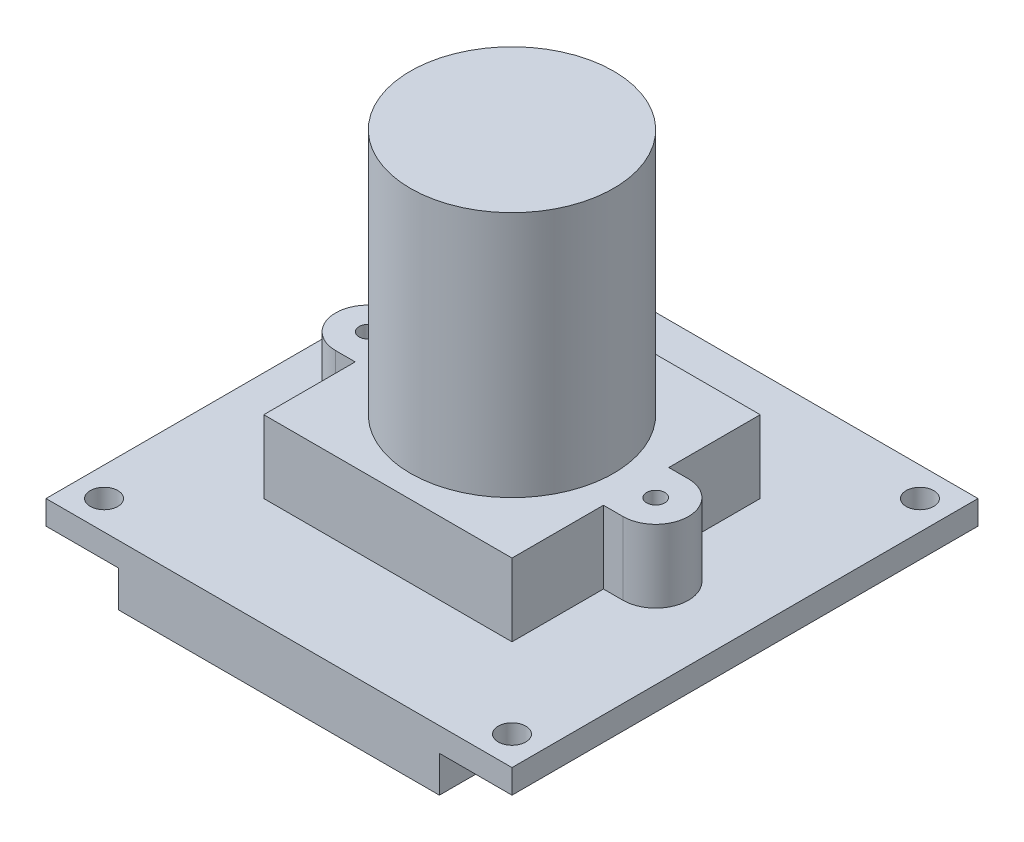
ISO-10303-21;
HEADER;
FILE_DESCRIPTION(('STEP AP214'),'2;1');
FILE_NAME('part.step','',(''),(''),'','','');
FILE_SCHEMA(('AUTOMOTIVE_DESIGN { 1 0 10303 214 1 1 1 1 }'));
ENDSEC;
DATA;
#1=APPLICATION_CONTEXT('core data for automotive mechanical design processes');
#2=APPLICATION_PROTOCOL_DEFINITION('international standard','automotive_design',2000,#1);
#3=PRODUCT_CONTEXT('',#1,'mechanical');
#4=PRODUCT('Part','Part','',(#3));
#5=PRODUCT_RELATED_PRODUCT_CATEGORY('part','',(#4));
#6=PRODUCT_DEFINITION_FORMATION('','',#4);
#7=PRODUCT_DEFINITION_CONTEXT('part definition',#1,'design');
#8=PRODUCT_DEFINITION('design','',#6,#7);
#9=PRODUCT_DEFINITION_SHAPE('','',#8);
#10=(LENGTH_UNIT() NAMED_UNIT(*) SI_UNIT(.MILLI.,.METRE.));
#11=(NAMED_UNIT(*) PLANE_ANGLE_UNIT() SI_UNIT($,.RADIAN.));
#12=(NAMED_UNIT(*) SI_UNIT($,.STERADIAN.) SOLID_ANGLE_UNIT());
#13=UNCERTAINTY_MEASURE_WITH_UNIT(LENGTH_MEASURE(1.E-05),#10,'distance_accuracy_value','');
#14=(GEOMETRIC_REPRESENTATION_CONTEXT(3) GLOBAL_UNCERTAINTY_ASSIGNED_CONTEXT((#13)) GLOBAL_UNIT_ASSIGNED_CONTEXT((#10,
#11,#12)) REPRESENTATION_CONTEXT('',''));
#15=CARTESIAN_POINT('',(0.,0.,0.));
#16=DIRECTION('',(0.,0.,1.));
#17=DIRECTION('',(1.,0.,0.));
#18=AXIS2_PLACEMENT_3D('',#15,#16,#17);
#19=CARTESIAN_POINT('',(0.,0.,0.));
#20=DIRECTION('',(0.,1.,0.));
#21=DIRECTION('',(0.,0.,1.));
#22=AXIS2_PLACEMENT_3D('',#19,#20,#21);
#23=PLANE('',#22);
#24=CARTESIAN_POINT('',(-14.05,0.,14.05));
#25=DIRECTION('',(0.,1.,0.));
#26=DIRECTION('',(0.,0.,-1.));
#27=AXIS2_PLACEMENT_3D('',#24,#25,#26);
#28=CIRCLE('',#27,0.949999999999999);
#29=CARTESIAN_POINT('',(-14.05,0.,13.1));
#30=VERTEX_POINT('',#29);
#31=EDGE_CURVE('E248',#30,#30,#28,.T.);
#32=ORIENTED_EDGE('',*,*,#31,.T.);
#33=EDGE_LOOP('',(#32));
#34=FACE_BOUND('',#33,.T.);
#35=CARTESIAN_POINT('',(14.05,0.,14.05));
#36=DIRECTION('',(0.,1.,0.));
#37=DIRECTION('',(0.,0.,1.));
#38=AXIS2_PLACEMENT_3D('',#35,#36,#37);
#39=CIRCLE('',#38,0.949999999999999);
#40=CARTESIAN_POINT('',(14.05,0.,15.));
#41=VERTEX_POINT('',#40);
#42=EDGE_CURVE('E253',#41,#41,#39,.T.);
#43=ORIENTED_EDGE('',*,*,#42,.T.);
#44=EDGE_LOOP('',(#43));
#45=FACE_BOUND('',#44,.T.);
#46=CARTESIAN_POINT('',(14.05,0.,-14.05));
#47=DIRECTION('',(0.,1.,0.));
#48=DIRECTION('',(0.,0.,-1.));
#49=AXIS2_PLACEMENT_3D('',#46,#47,#48);
#50=CIRCLE('',#49,0.949999999999999);
#51=CARTESIAN_POINT('',(14.05,0.,-15.));
#52=VERTEX_POINT('',#51);
#53=EDGE_CURVE('E261',#52,#52,#50,.T.);
#54=ORIENTED_EDGE('',*,*,#53,.T.);
#55=EDGE_LOOP('',(#54));
#56=FACE_BOUND('',#55,.T.);
#57=CARTESIAN_POINT('',(-14.05,0.,-14.05));
#58=DIRECTION('',(0.,1.,0.));
#59=DIRECTION('',(0.,0.,1.));
#60=AXIS2_PLACEMENT_3D('',#57,#58,#59);
#61=CIRCLE('',#60,0.949999999999999);
#62=CARTESIAN_POINT('',(-14.05,0.,-13.1));
#63=VERTEX_POINT('',#62);
#64=EDGE_CURVE('E269',#63,#63,#61,.T.);
#65=ORIENTED_EDGE('',*,*,#64,.T.);
#66=EDGE_LOOP('',(#65));
#67=FACE_BOUND('',#66,.T.);
#68=DIRECTION('',(0.,0.,-1.));
#69=VECTOR('',#68,1.);
#70=CARTESIAN_POINT('',(-11.05,0.,16.05));
#71=LINE('',#70,#69);
#72=CARTESIAN_POINT('',(-11.05,0.,16.05));
#73=VERTEX_POINT('',#72);
#74=CARTESIAN_POINT('',(-11.05,0.,9.3));
#75=VERTEX_POINT('',#74);
#76=EDGE_CURVE('E201',#73,#75,#71,.T.);
#77=ORIENTED_EDGE('',*,*,#76,.F.);
#78=DIRECTION('',(1.,0.,0.));
#79=VECTOR('',#78,1.);
#80=CARTESIAN_POINT('',(-16.05,0.,16.05));
#81=LINE('',#80,#79);
#82=CARTESIAN_POINT('',(-16.05,0.,16.05));
#83=VERTEX_POINT('',#82);
#84=EDGE_CURVE('E300',#83,#73,#81,.T.);
#85=ORIENTED_EDGE('',*,*,#84,.F.);
#86=DIRECTION('',(0.,0.,1.));
#87=VECTOR('',#86,1.);
#88=CARTESIAN_POINT('',(-16.05,0.,-16.05));
#89=LINE('',#88,#87);
#90=CARTESIAN_POINT('',(-16.05,0.,-16.05));
#91=VERTEX_POINT('',#90);
#92=EDGE_CURVE('E277',#91,#83,#89,.T.);
#93=ORIENTED_EDGE('',*,*,#92,.F.);
#94=DIRECTION('',(-1.,0.,0.));
#95=VECTOR('',#94,1.);
#96=CARTESIAN_POINT('',(-16.05,0.,-16.05));
#97=LINE('',#96,#95);
#98=CARTESIAN_POINT('',(16.05,0.,-16.05));
#99=VERTEX_POINT('',#98);
#100=EDGE_CURVE('E286',#99,#91,#97,.T.);
#101=ORIENTED_EDGE('',*,*,#100,.F.);
#102=DIRECTION('',(0.,0.,-1.));
#103=VECTOR('',#102,1.);
#104=CARTESIAN_POINT('',(16.05,0.,-16.05));
#105=LINE('',#104,#103);
#106=CARTESIAN_POINT('',(16.05,0.,16.05));
#107=VERTEX_POINT('',#106);
#108=EDGE_CURVE('E304',#107,#99,#105,.T.);
#109=ORIENTED_EDGE('',*,*,#108,.F.);
#110=CARTESIAN_POINT('',(11.05,0.,16.05));
#111=VERTEX_POINT('',#110);
#112=EDGE_CURVE('E299',#111,#107,#81,.T.);
#113=ORIENTED_EDGE('',*,*,#112,.F.);
#114=DIRECTION('',(0.,0.,1.));
#115=VECTOR('',#114,1.);
#116=CARTESIAN_POINT('',(11.05,0.,16.05));
#117=LINE('',#116,#115);
#118=CARTESIAN_POINT('',(11.05,0.,9.3));
#119=VERTEX_POINT('',#118);
#120=EDGE_CURVE('E217',#119,#111,#117,.T.);
#121=ORIENTED_EDGE('',*,*,#120,.F.);
#122=DIRECTION('',(1.,0.,0.));
#123=VECTOR('',#122,1.);
#124=CARTESIAN_POINT('',(-11.05,0.,9.3));
#125=LINE('',#124,#123);
#126=EDGE_CURVE('E206',#75,#119,#125,.T.);
#127=ORIENTED_EDGE('',*,*,#126,.F.);
#128=EDGE_LOOP('',(#77,#85,#93,#101,#109,#113,#121,#127));
#129=FACE_BOUND('',#128,.T.);
#130=ADVANCED_FACE('F39',(#34,#45,#56,#67,#129),#23,.F.);
#131=CARTESIAN_POINT('',(0.,1.65,0.));
#132=DIRECTION('',(0.,1.,0.));
#133=DIRECTION('',(0.,0.,1.));
#134=AXIS2_PLACEMENT_3D('',#131,#132,#133);
#135=PLANE('',#134);
#136=DIRECTION('',(0.,0.,1.));
#137=VECTOR('',#136,1.);
#138=CARTESIAN_POINT('',(-8.55,1.65,-8.55));
#139=LINE('',#138,#137);
#140=CARTESIAN_POINT('',(-8.55,1.65,-8.55));
#141=VERTEX_POINT('',#140);
#142=CARTESIAN_POINT('',(-8.55,1.65,-2.25));
#143=VERTEX_POINT('',#142);
#144=EDGE_CURVE('E55',#141,#143,#139,.T.);
#145=ORIENTED_EDGE('',*,*,#144,.F.);
#146=DIRECTION('',(-1.,0.,0.));
#147=VECTOR('',#146,1.);
#148=CARTESIAN_POINT('',(-8.55,1.65,-8.55));
#149=LINE('',#148,#147);
#150=CARTESIAN_POINT('',(8.55,1.65,-8.55));
#151=VERTEX_POINT('',#150);
#152=EDGE_CURVE('E59',#151,#141,#149,.T.);
#153=ORIENTED_EDGE('',*,*,#152,.F.);
#154=DIRECTION('',(0.,0.,-1.));
#155=VECTOR('',#154,1.);
#156=CARTESIAN_POINT('',(8.55,1.65,-8.55));
#157=LINE('',#156,#155);
#158=CARTESIAN_POINT('',(8.55,1.65,-2.25));
#159=VERTEX_POINT('',#158);
#160=EDGE_CURVE('E768',#159,#151,#157,.T.);
#161=ORIENTED_EDGE('',*,*,#160,.F.);
#162=DIRECTION('',(-1.,0.,0.));
#163=VECTOR('',#162,1.);
#164=CARTESIAN_POINT('',(9.9,1.65,-2.25));
#165=LINE('',#164,#163);
#166=CARTESIAN_POINT('',(9.9,1.65,-2.25));
#167=VERTEX_POINT('',#166);
#168=EDGE_CURVE('E764',#167,#159,#165,.T.);
#169=ORIENTED_EDGE('',*,*,#168,.F.);
#170=CARTESIAN_POINT('',(9.9,1.65,0.));
#171=DIRECTION('',(0.,1.,0.));
#172=DIRECTION('',(0.,0.,-1.));
#173=AXIS2_PLACEMENT_3D('',#170,#171,#172);
#174=CIRCLE('',#173,2.25);
#175=CARTESIAN_POINT('',(9.9,1.65,2.25));
#176=VERTEX_POINT('',#175);
#177=EDGE_CURVE('E760',#176,#167,#174,.T.);
#178=ORIENTED_EDGE('',*,*,#177,.F.);
#179=DIRECTION('',(1.,0.,0.));
#180=VECTOR('',#179,1.);
#181=CARTESIAN_POINT('',(9.9,1.65,2.25));
#182=LINE('',#181,#180);
#183=CARTESIAN_POINT('',(8.55,1.65,2.25));
#184=VERTEX_POINT('',#183);
#185=EDGE_CURVE('E756',#184,#176,#182,.T.);
#186=ORIENTED_EDGE('',*,*,#185,.F.);
#187=DIRECTION('',(0.,0.,-1.));
#188=VECTOR('',#187,1.);
#189=CARTESIAN_POINT('',(8.55,1.65,2.25));
#190=LINE('',#189,#188);
#191=CARTESIAN_POINT('',(8.55,1.65,8.55));
#192=VERTEX_POINT('',#191);
#193=EDGE_CURVE('E752',#192,#184,#190,.T.);
#194=ORIENTED_EDGE('',*,*,#193,.F.);
#195=DIRECTION('',(1.,0.,0.));
#196=VECTOR('',#195,1.);
#197=CARTESIAN_POINT('',(-8.55,1.65,8.55));
#198=LINE('',#197,#196);
#199=CARTESIAN_POINT('',(-8.55,1.65,8.55));
#200=VERTEX_POINT('',#199);
#201=EDGE_CURVE('E748',#200,#192,#198,.T.);
#202=ORIENTED_EDGE('',*,*,#201,.F.);
#203=DIRECTION('',(0.,0.,1.));
#204=VECTOR('',#203,1.);
#205=CARTESIAN_POINT('',(-8.55,1.65,2.25));
#206=LINE('',#205,#204);
#207=CARTESIAN_POINT('',(-8.55,1.65,2.25));
#208=VERTEX_POINT('',#207);
#209=EDGE_CURVE('E744',#208,#200,#206,.T.);
#210=ORIENTED_EDGE('',*,*,#209,.F.);
#211=DIRECTION('',(1.,0.,0.));
#212=VECTOR('',#211,1.);
#213=CARTESIAN_POINT('',(-9.9,1.65,2.25));
#214=LINE('',#213,#212);
#215=CARTESIAN_POINT('',(-9.9,1.65,2.25));
#216=VERTEX_POINT('',#215);
#217=EDGE_CURVE('E740',#216,#208,#214,.T.);
#218=ORIENTED_EDGE('',*,*,#217,.F.);
#219=CARTESIAN_POINT('',(-9.9,1.65,0.));
#220=DIRECTION('',(0.,1.,0.));
#221=DIRECTION('',(0.,0.,1.));
#222=AXIS2_PLACEMENT_3D('',#219,#220,#221);
#223=CIRCLE('',#222,2.25);
#224=CARTESIAN_POINT('',(-9.9,1.65,-2.25));
#225=VERTEX_POINT('',#224);
#226=EDGE_CURVE('E736',#225,#216,#223,.T.);
#227=ORIENTED_EDGE('',*,*,#226,.F.);
#228=DIRECTION('',(-1.,0.,0.));
#229=VECTOR('',#228,1.);
#230=CARTESIAN_POINT('',(-9.9,1.65,-2.25));
#231=LINE('',#230,#229);
#232=EDGE_CURVE('E733',#143,#225,#231,.T.);
#233=ORIENTED_EDGE('',*,*,#232,.F.);
#234=EDGE_LOOP('',(#145,#153,#161,#169,#178,#186,#194,#202,#210,#218,#227,#233));
#235=FACE_BOUND('',#234,.T.);
#236=CARTESIAN_POINT('',(14.05,1.65,14.05));
#237=DIRECTION('',(0.,1.,0.));
#238=DIRECTION('',(0.,0.,1.));
#239=AXIS2_PLACEMENT_3D('',#236,#237,#238);
#240=CIRCLE('',#239,0.949999999999999);
#241=CARTESIAN_POINT('',(14.05,1.65,15.));
#242=VERTEX_POINT('',#241);
#243=EDGE_CURVE('E257',#242,#242,#240,.T.);
#244=ORIENTED_EDGE('',*,*,#243,.F.);
#245=EDGE_LOOP('',(#244));
#246=FACE_BOUND('',#245,.T.);
#247=CARTESIAN_POINT('',(-14.05,1.65,-14.05));
#248=DIRECTION('',(0.,1.,0.));
#249=DIRECTION('',(0.,0.,1.));
#250=AXIS2_PLACEMENT_3D('',#247,#248,#249);
#251=CIRCLE('',#250,0.949999999999999);
#252=CARTESIAN_POINT('',(-14.05,1.65,-13.1));
#253=VERTEX_POINT('',#252);
#254=EDGE_CURVE('E273',#253,#253,#251,.T.);
#255=ORIENTED_EDGE('',*,*,#254,.F.);
#256=EDGE_LOOP('',(#255));
#257=FACE_BOUND('',#256,.T.);
#258=DIRECTION('',(0.,0.,1.));
#259=VECTOR('',#258,1.);
#260=CARTESIAN_POINT('',(-16.05,1.65,-16.05));
#261=LINE('',#260,#259);
#262=CARTESIAN_POINT('',(-16.05,1.65,-16.05));
#263=VERTEX_POINT('',#262);
#264=CARTESIAN_POINT('',(-16.05,1.65,16.05));
#265=VERTEX_POINT('',#264);
#266=EDGE_CURVE('E281',#263,#265,#261,.T.);
#267=ORIENTED_EDGE('',*,*,#266,.T.);
#268=DIRECTION('',(1.,0.,0.));
#269=VECTOR('',#268,1.);
#270=CARTESIAN_POINT('',(-16.05,1.65,16.05));
#271=LINE('',#270,#269);
#272=CARTESIAN_POINT('',(16.05,1.65,16.05));
#273=VERTEX_POINT('',#272);
#274=EDGE_CURVE('E285',#265,#273,#271,.T.);
#275=ORIENTED_EDGE('',*,*,#274,.T.);
#276=DIRECTION('',(0.,0.,-1.));
#277=VECTOR('',#276,1.);
#278=CARTESIAN_POINT('',(16.05,1.65,-16.05));
#279=LINE('',#278,#277);
#280=CARTESIAN_POINT('',(16.05,1.65,-16.05));
#281=VERTEX_POINT('',#280);
#282=EDGE_CURVE('E289',#273,#281,#279,.T.);
#283=ORIENTED_EDGE('',*,*,#282,.T.);
#284=DIRECTION('',(-1.,0.,0.));
#285=VECTOR('',#284,1.);
#286=CARTESIAN_POINT('',(-16.05,1.65,-16.05));
#287=LINE('',#286,#285);
#288=EDGE_CURVE('E292',#281,#263,#287,.T.);
#289=ORIENTED_EDGE('',*,*,#288,.T.);
#290=EDGE_LOOP('',(#267,#275,#283,#289));
#291=FACE_BOUND('',#290,.T.);
#292=CARTESIAN_POINT('',(14.05,1.65,-14.05));
#293=DIRECTION('',(0.,1.,0.));
#294=DIRECTION('',(0.,0.,-1.));
#295=AXIS2_PLACEMENT_3D('',#292,#293,#294);
#296=CIRCLE('',#295,0.949999999999999);
#297=CARTESIAN_POINT('',(14.05,1.65,-15.));
#298=VERTEX_POINT('',#297);
#299=EDGE_CURVE('E265',#298,#298,#296,.T.);
#300=ORIENTED_EDGE('',*,*,#299,.F.);
#301=EDGE_LOOP('',(#300));
#302=FACE_BOUND('',#301,.T.);
#303=CARTESIAN_POINT('',(-14.05,1.65,14.05));
#304=DIRECTION('',(0.,1.,0.));
#305=DIRECTION('',(0.,0.,-1.));
#306=AXIS2_PLACEMENT_3D('',#303,#304,#305);
#307=CIRCLE('',#306,0.949999999999999);
#308=CARTESIAN_POINT('',(-14.05,1.65,13.1));
#309=VERTEX_POINT('',#308);
#310=EDGE_CURVE('E249',#309,#309,#307,.T.);
#311=ORIENTED_EDGE('',*,*,#310,.F.);
#312=EDGE_LOOP('',(#311));
#313=FACE_BOUND('',#312,.T.);
#314=ADVANCED_FACE('F335',(#235,#246,#257,#291,#302,#313),#135,.T.);
#315=CARTESIAN_POINT('',(-16.05,1.65,-16.05));
#316=DIRECTION('',(1.,0.,0.));
#317=DIRECTION('',(0.,0.,-1.));
#318=AXIS2_PLACEMENT_3D('',#315,#316,#317);
#319=PLANE('',#318);
#320=ORIENTED_EDGE('',*,*,#92,.T.);
#321=DIRECTION('',(0.,-1.,0.));
#322=VECTOR('',#321,1.);
#323=CARTESIAN_POINT('',(-16.05,1.65,16.05));
#324=LINE('',#323,#322);
#325=EDGE_CURVE('E11',#265,#83,#324,.T.);
#326=ORIENTED_EDGE('',*,*,#325,.F.);
#327=ORIENTED_EDGE('',*,*,#266,.F.);
#328=DIRECTION('',(0.,-1.,0.));
#329=VECTOR('',#328,1.);
#330=CARTESIAN_POINT('',(-16.05,1.65,-16.05));
#331=LINE('',#330,#329);
#332=EDGE_CURVE('E295',#263,#91,#331,.T.);
#333=ORIENTED_EDGE('',*,*,#332,.T.);
#334=EDGE_LOOP('',(#320,#326,#327,#333));
#335=FACE_BOUND('',#334,.T.);
#336=ADVANCED_FACE('F41',(#335),#319,.F.);
#337=CARTESIAN_POINT('',(-16.05,1.65,16.05));
#338=DIRECTION('',(0.,0.,-1.));
#339=DIRECTION('',(-1.,0.,0.));
#340=AXIS2_PLACEMENT_3D('',#337,#338,#339);
#341=PLANE('',#340);
#342=ORIENTED_EDGE('',*,*,#84,.T.);
#343=DIRECTION('',(0.,1.,0.));
#344=VECTOR('',#343,1.);
#345=CARTESIAN_POINT('',(-11.05,-2.5,16.05));
#346=LINE('',#345,#344);
#347=CARTESIAN_POINT('',(-11.05,-2.5,16.05));
#348=VERTEX_POINT('',#347);
#349=EDGE_CURVE('E225',#348,#73,#346,.T.);
#350=ORIENTED_EDGE('',*,*,#349,.F.);
#351=DIRECTION('',(-1.,0.,0.));
#352=VECTOR('',#351,1.);
#353=CARTESIAN_POINT('',(-11.05,-2.5,16.05));
#354=LINE('',#353,#352);
#355=CARTESIAN_POINT('',(11.05,-2.5,16.05));
#356=VERTEX_POINT('',#355);
#357=EDGE_CURVE('E223',#356,#348,#354,.T.);
#358=ORIENTED_EDGE('',*,*,#357,.F.);
#359=DIRECTION('',(0.,1.,0.));
#360=VECTOR('',#359,1.);
#361=CARTESIAN_POINT('',(11.05,-2.5,16.05));
#362=LINE('',#361,#360);
#363=EDGE_CURVE('E236',#356,#111,#362,.T.);
#364=ORIENTED_EDGE('',*,*,#363,.T.);
#365=ORIENTED_EDGE('',*,*,#112,.T.);
#366=DIRECTION('',(0.,-1.,0.));
#367=VECTOR('',#366,1.);
#368=CARTESIAN_POINT('',(16.05,1.65,16.05));
#369=LINE('',#368,#367);
#370=EDGE_CURVE('E48',#273,#107,#369,.T.);
#371=ORIENTED_EDGE('',*,*,#370,.F.);
#372=ORIENTED_EDGE('',*,*,#274,.F.);
#373=ORIENTED_EDGE('',*,*,#325,.T.);
#374=EDGE_LOOP('',(#342,#350,#358,#364,#365,#371,#372,#373));
#375=FACE_BOUND('',#374,.T.);
#376=ADVANCED_FACE('F337',(#375),#341,.F.);
#377=CARTESIAN_POINT('',(16.05,1.65,-16.05));
#378=DIRECTION('',(-1.,0.,0.));
#379=DIRECTION('',(0.,0.,1.));
#380=AXIS2_PLACEMENT_3D('',#377,#378,#379);
#381=PLANE('',#380);
#382=ORIENTED_EDGE('',*,*,#108,.T.);
#383=DIRECTION('',(0.,-1.,0.));
#384=VECTOR('',#383,1.);
#385=CARTESIAN_POINT('',(16.05,1.65,-16.05));
#386=LINE('',#385,#384);
#387=EDGE_CURVE('E312',#281,#99,#386,.T.);
#388=ORIENTED_EDGE('',*,*,#387,.F.);
#389=ORIENTED_EDGE('',*,*,#282,.F.);
#390=ORIENTED_EDGE('',*,*,#370,.T.);
#391=EDGE_LOOP('',(#382,#388,#389,#390));
#392=FACE_BOUND('',#391,.T.);
#393=ADVANCED_FACE('F321',(#392),#381,.F.);
#394=CARTESIAN_POINT('',(-16.05,1.65,-16.05));
#395=DIRECTION('',(0.,0.,1.));
#396=DIRECTION('',(1.,0.,0.));
#397=AXIS2_PLACEMENT_3D('',#394,#395,#396);
#398=PLANE('',#397);
#399=ORIENTED_EDGE('',*,*,#100,.T.);
#400=ORIENTED_EDGE('',*,*,#332,.F.);
#401=ORIENTED_EDGE('',*,*,#288,.F.);
#402=ORIENTED_EDGE('',*,*,#387,.T.);
#403=EDGE_LOOP('',(#399,#400,#401,#402));
#404=FACE_BOUND('',#403,.T.);
#405=ADVANCED_FACE('F329',(#404),#398,.F.);
#406=CARTESIAN_POINT('',(-14.05,1.65,-14.05));
#407=DIRECTION('',(0.,-1.,0.));
#408=DIRECTION('',(0.,0.,-1.));
#409=AXIS2_PLACEMENT_3D('',#406,#407,#408);
#410=CYLINDRICAL_SURFACE('',#409,0.949999999999999);
#411=ORIENTED_EDGE('',*,*,#254,.T.);
#412=EDGE_LOOP('',(#411));
#413=FACE_BOUND('',#412,.T.);
#414=ORIENTED_EDGE('',*,*,#64,.F.);
#415=EDGE_LOOP('',(#414));
#416=FACE_BOUND('',#415,.T.);
#417=ADVANCED_FACE('F376',(#413,#416),#410,.F.);
#418=CARTESIAN_POINT('',(14.05,1.65,-14.05));
#419=DIRECTION('',(0.,-1.,0.));
#420=DIRECTION('',(0.,0.,-1.));
#421=AXIS2_PLACEMENT_3D('',#418,#419,#420);
#422=CYLINDRICAL_SURFACE('',#421,0.949999999999999);
#423=ORIENTED_EDGE('',*,*,#299,.T.);
#424=EDGE_LOOP('',(#423));
#425=FACE_BOUND('',#424,.T.);
#426=ORIENTED_EDGE('',*,*,#53,.F.);
#427=EDGE_LOOP('',(#426));
#428=FACE_BOUND('',#427,.T.);
#429=ADVANCED_FACE('F621',(#425,#428),#422,.F.);
#430=CARTESIAN_POINT('',(14.05,1.65,14.05));
#431=DIRECTION('',(0.,-1.,0.));
#432=DIRECTION('',(0.,0.,-1.));
#433=AXIS2_PLACEMENT_3D('',#430,#431,#432);
#434=CYLINDRICAL_SURFACE('',#433,0.949999999999999);
#435=ORIENTED_EDGE('',*,*,#243,.T.);
#436=EDGE_LOOP('',(#435));
#437=FACE_BOUND('',#436,.T.);
#438=ORIENTED_EDGE('',*,*,#42,.F.);
#439=EDGE_LOOP('',(#438));
#440=FACE_BOUND('',#439,.T.);
#441=ADVANCED_FACE('F611',(#437,#440),#434,.F.);
#442=CARTESIAN_POINT('',(-14.05,1.65,14.05));
#443=DIRECTION('',(0.,-1.,0.));
#444=DIRECTION('',(0.,0.,-1.));
#445=AXIS2_PLACEMENT_3D('',#442,#443,#444);
#446=CYLINDRICAL_SURFACE('',#445,0.949999999999999);
#447=ORIENTED_EDGE('',*,*,#310,.T.);
#448=EDGE_LOOP('',(#447));
#449=FACE_BOUND('',#448,.T.);
#450=ORIENTED_EDGE('',*,*,#31,.F.);
#451=EDGE_LOOP('',(#450));
#452=FACE_BOUND('',#451,.T.);
#453=ADVANCED_FACE('F360',(#449,#452),#446,.F.);
#454=CARTESIAN_POINT('',(-11.05,-2.5,16.05));
#455=DIRECTION('',(1.,0.,0.));
#456=DIRECTION('',(0.,0.,-1.));
#457=AXIS2_PLACEMENT_3D('',#454,#455,#456);
#458=PLANE('',#457);
#459=ORIENTED_EDGE('',*,*,#76,.T.);
#460=DIRECTION('',(0.,1.,0.));
#461=VECTOR('',#460,1.);
#462=CARTESIAN_POINT('',(-11.05,-2.5,9.3));
#463=LINE('',#462,#461);
#464=CARTESIAN_POINT('',(-11.05,-2.5,9.3));
#465=VERTEX_POINT('',#464);
#466=EDGE_CURVE('E244',#465,#75,#463,.T.);
#467=ORIENTED_EDGE('',*,*,#466,.F.);
#468=DIRECTION('',(0.,0.,-1.));
#469=VECTOR('',#468,1.);
#470=CARTESIAN_POINT('',(-11.05,-2.5,16.05));
#471=LINE('',#470,#469);
#472=EDGE_CURVE('E212',#348,#465,#471,.T.);
#473=ORIENTED_EDGE('',*,*,#472,.F.);
#474=ORIENTED_EDGE('',*,*,#349,.T.);
#475=EDGE_LOOP('',(#459,#467,#473,#474));
#476=FACE_BOUND('',#475,.T.);
#477=ADVANCED_FACE('F342',(#476),#458,.F.);
#478=CARTESIAN_POINT('',(-11.05,-2.5,9.3));
#479=DIRECTION('',(0.,0.,1.));
#480=DIRECTION('',(1.,0.,0.));
#481=AXIS2_PLACEMENT_3D('',#478,#479,#480);
#482=PLANE('',#481);
#483=ORIENTED_EDGE('',*,*,#126,.T.);
#484=DIRECTION('',(0.,1.,0.));
#485=VECTOR('',#484,1.);
#486=CARTESIAN_POINT('',(11.05,-2.5,9.3));
#487=LINE('',#486,#485);
#488=CARTESIAN_POINT('',(11.05,-2.5,9.3));
#489=VERTEX_POINT('',#488);
#490=EDGE_CURVE('E240',#489,#119,#487,.T.);
#491=ORIENTED_EDGE('',*,*,#490,.F.);
#492=DIRECTION('',(1.,0.,0.));
#493=VECTOR('',#492,1.);
#494=CARTESIAN_POINT('',(-11.05,-2.5,9.3));
#495=LINE('',#494,#493);
#496=EDGE_CURVE('E216',#465,#489,#495,.T.);
#497=ORIENTED_EDGE('',*,*,#496,.F.);
#498=ORIENTED_EDGE('',*,*,#466,.T.);
#499=EDGE_LOOP('',(#483,#491,#497,#498));
#500=FACE_BOUND('',#499,.T.);
#501=ADVANCED_FACE('F352',(#500),#482,.F.);
#502=CARTESIAN_POINT('',(11.05,-2.5,16.05));
#503=DIRECTION('',(-1.,0.,0.));
#504=DIRECTION('',(0.,0.,1.));
#505=AXIS2_PLACEMENT_3D('',#502,#503,#504);
#506=PLANE('',#505);
#507=ORIENTED_EDGE('',*,*,#120,.T.);
#508=ORIENTED_EDGE('',*,*,#363,.F.);
#509=DIRECTION('',(0.,0.,1.));
#510=VECTOR('',#509,1.);
#511=CARTESIAN_POINT('',(11.05,-2.5,16.05));
#512=LINE('',#511,#510);
#513=EDGE_CURVE('E220',#489,#356,#512,.T.);
#514=ORIENTED_EDGE('',*,*,#513,.F.);
#515=ORIENTED_EDGE('',*,*,#490,.T.);
#516=EDGE_LOOP('',(#507,#508,#514,#515));
#517=FACE_BOUND('',#516,.T.);
#518=ADVANCED_FACE('F350',(#517),#506,.F.);
#519=CARTESIAN_POINT('',(0.,-2.5,0.));
#520=DIRECTION('',(0.,-1.,0.));
#521=DIRECTION('',(0.,0.,-1.));
#522=AXIS2_PLACEMENT_3D('',#519,#520,#521);
#523=PLANE('',#522);
#524=ORIENTED_EDGE('',*,*,#472,.T.);
#525=ORIENTED_EDGE('',*,*,#496,.T.);
#526=ORIENTED_EDGE('',*,*,#513,.T.);
#527=ORIENTED_EDGE('',*,*,#357,.T.);
#528=EDGE_LOOP('',(#524,#525,#526,#527));
#529=FACE_BOUND('',#528,.T.);
#530=ADVANCED_FACE('F345',(#529),#523,.T.);
#531=CARTESIAN_POINT('',(-9.9,6.65,0.));
#532=DIRECTION('',(0.,1.,0.));
#533=DIRECTION('',(0.,0.,1.));
#534=AXIS2_PLACEMENT_3D('',#531,#532,#533);
#535=PLANE('',#534);
#536=CARTESIAN_POINT('',(0.,6.65,0.));
#537=DIRECTION('',(0.,1.,0.));
#538=DIRECTION('',(0.,0.,1.));
#539=AXIS2_PLACEMENT_3D('',#536,#537,#538);
#540=CIRCLE('',#539,7.);
#541=CARTESIAN_POINT('',(0.,6.65,7.));
#542=VERTEX_POINT('',#541);
#543=EDGE_CURVE('E681',#542,#542,#540,.T.);
#544=ORIENTED_EDGE('',*,*,#543,.F.);
#545=EDGE_LOOP('',(#544));
#546=FACE_BOUND('',#545,.T.);
#547=CARTESIAN_POINT('',(9.9,6.65,0.));
#548=DIRECTION('',(0.,1.,0.));
#549=DIRECTION('',(0.,0.,1.));
#550=AXIS2_PLACEMENT_3D('',#547,#548,#549);
#551=CIRCLE('',#550,0.625000000000001);
#552=CARTESIAN_POINT('',(9.9,6.65,0.624999999999999));
#553=VERTEX_POINT('',#552);
#554=EDGE_CURVE('E695',#553,#553,#551,.T.);
#555=ORIENTED_EDGE('',*,*,#554,.F.);
#556=EDGE_LOOP('',(#555));
#557=FACE_BOUND('',#556,.T.);
#558=DIRECTION('',(0.,0.,1.));
#559=VECTOR('',#558,1.);
#560=CARTESIAN_POINT('',(-8.55,6.65,-8.55));
#561=LINE('',#560,#559);
#562=CARTESIAN_POINT('',(-8.55,6.65,-8.55));
#563=VERTEX_POINT('',#562);
#564=CARTESIAN_POINT('',(-8.55,6.65,-2.25));
#565=VERTEX_POINT('',#564);
#566=EDGE_CURVE('E187',#563,#565,#561,.T.);
#567=ORIENTED_EDGE('',*,*,#566,.T.);
#568=DIRECTION('',(-1.,0.,0.));
#569=VECTOR('',#568,1.);
#570=CARTESIAN_POINT('',(-9.9,6.65,-2.25));
#571=LINE('',#570,#569);
#572=CARTESIAN_POINT('',(-9.9,6.65,-2.25));
#573=VERTEX_POINT('',#572);
#574=EDGE_CURVE('E175',#565,#573,#571,.T.);
#575=ORIENTED_EDGE('',*,*,#574,.T.);
#576=CARTESIAN_POINT('',(-9.9,6.65,0.));
#577=DIRECTION('',(0.,1.,0.));
#578=DIRECTION('',(0.,0.,1.));
#579=AXIS2_PLACEMENT_3D('',#576,#577,#578);
#580=CIRCLE('',#579,2.25);
#581=CARTESIAN_POINT('',(-9.9,6.65,2.25));
#582=VERTEX_POINT('',#581);
#583=EDGE_CURVE('E186',#573,#582,#580,.T.);
#584=ORIENTED_EDGE('',*,*,#583,.T.);
#585=DIRECTION('',(1.,0.,0.));
#586=VECTOR('',#585,1.);
#587=CARTESIAN_POINT('',(-9.9,6.65,2.25));
#588=LINE('',#587,#586);
#589=CARTESIAN_POINT('',(-8.55,6.65,2.25));
#590=VERTEX_POINT('',#589);
#591=EDGE_CURVE('E704',#582,#590,#588,.T.);
#592=ORIENTED_EDGE('',*,*,#591,.T.);
#593=DIRECTION('',(0.,0.,1.));
#594=VECTOR('',#593,1.);
#595=CARTESIAN_POINT('',(-8.55,6.65,2.25));
#596=LINE('',#595,#594);
#597=CARTESIAN_POINT('',(-8.55,6.65,8.55));
#598=VERTEX_POINT('',#597);
#599=EDGE_CURVE('E707',#590,#598,#596,.T.);
#600=ORIENTED_EDGE('',*,*,#599,.T.);
#601=DIRECTION('',(1.,0.,0.));
#602=VECTOR('',#601,1.);
#603=CARTESIAN_POINT('',(-8.55,6.65,8.55));
#604=LINE('',#603,#602);
#605=CARTESIAN_POINT('',(8.55,6.65,8.55));
#606=VERTEX_POINT('',#605);
#607=EDGE_CURVE('E710',#598,#606,#604,.T.);
#608=ORIENTED_EDGE('',*,*,#607,.T.);
#609=DIRECTION('',(0.,0.,-1.));
#610=VECTOR('',#609,1.);
#611=CARTESIAN_POINT('',(8.55,6.65,2.25));
#612=LINE('',#611,#610);
#613=CARTESIAN_POINT('',(8.55,6.65,2.25));
#614=VERTEX_POINT('',#613);
#615=EDGE_CURVE('E713',#606,#614,#612,.T.);
#616=ORIENTED_EDGE('',*,*,#615,.T.);
#617=DIRECTION('',(1.,0.,0.));
#618=VECTOR('',#617,1.);
#619=CARTESIAN_POINT('',(9.9,6.65,2.25));
#620=LINE('',#619,#618);
#621=CARTESIAN_POINT('',(9.9,6.65,2.25));
#622=VERTEX_POINT('',#621);
#623=EDGE_CURVE('E716',#614,#622,#620,.T.);
#624=ORIENTED_EDGE('',*,*,#623,.T.);
#625=CARTESIAN_POINT('',(9.9,6.65,0.));
#626=DIRECTION('',(0.,1.,0.));
#627=DIRECTION('',(0.,0.,-1.));
#628=AXIS2_PLACEMENT_3D('',#625,#626,#627);
#629=CIRCLE('',#628,2.25);
#630=CARTESIAN_POINT('',(9.9,6.65,-2.25));
#631=VERTEX_POINT('',#630);
#632=EDGE_CURVE('E719',#622,#631,#629,.T.);
#633=ORIENTED_EDGE('',*,*,#632,.T.);
#634=DIRECTION('',(-1.,0.,0.));
#635=VECTOR('',#634,1.);
#636=CARTESIAN_POINT('',(9.9,6.65,-2.25));
#637=LINE('',#636,#635);
#638=CARTESIAN_POINT('',(8.55,6.65,-2.25));
#639=VERTEX_POINT('',#638);
#640=EDGE_CURVE('E722',#631,#639,#637,.T.);
#641=ORIENTED_EDGE('',*,*,#640,.T.);
#642=DIRECTION('',(0.,0.,-1.));
#643=VECTOR('',#642,1.);
#644=CARTESIAN_POINT('',(8.55,6.65,-8.55));
#645=LINE('',#644,#643);
#646=CARTESIAN_POINT('',(8.55,6.65,-8.55));
#647=VERTEX_POINT('',#646);
#648=EDGE_CURVE('E725',#639,#647,#645,.T.);
#649=ORIENTED_EDGE('',*,*,#648,.T.);
#650=DIRECTION('',(-1.,0.,0.));
#651=VECTOR('',#650,1.);
#652=CARTESIAN_POINT('',(-8.55,6.65,-8.55));
#653=LINE('',#652,#651);
#654=EDGE_CURVE('E193',#647,#563,#653,.T.);
#655=ORIENTED_EDGE('',*,*,#654,.T.);
#656=EDGE_LOOP('',(#567,#575,#584,#592,#600,#608,#616,#624,#633,#641,#649,#655));
#657=FACE_BOUND('',#656,.T.);
#658=CARTESIAN_POINT('',(-9.9,6.65,0.));
#659=DIRECTION('',(0.,1.,0.));
#660=DIRECTION('',(0.,0.,-1.));
#661=AXIS2_PLACEMENT_3D('',#658,#659,#660);
#662=CIRCLE('',#661,0.625000000000001);
#663=CARTESIAN_POINT('',(-9.9,6.65,-0.625000000000005));
#664=VERTEX_POINT('',#663);
#665=EDGE_CURVE('E686',#664,#664,#662,.T.);
#666=ORIENTED_EDGE('',*,*,#665,.F.);
#667=EDGE_LOOP('',(#666));
#668=FACE_BOUND('',#667,.T.);
#669=ADVANCED_FACE('F190',(#546,#557,#657,#668),#535,.T.);
#670=CARTESIAN_POINT('',(-8.55,6.65,-8.55));
#671=DIRECTION('',(1.,0.,0.));
#672=DIRECTION('',(0.,0.,-1.));
#673=AXIS2_PLACEMENT_3D('',#670,#671,#672);
#674=PLANE('',#673);
#675=ORIENTED_EDGE('',*,*,#144,.T.);
#676=DIRECTION('',(0.,-1.,0.));
#677=VECTOR('',#676,1.);
#678=CARTESIAN_POINT('',(-8.55,6.65,-2.25));
#679=LINE('',#678,#677);
#680=EDGE_CURVE('E180',#565,#143,#679,.T.);
#681=ORIENTED_EDGE('',*,*,#680,.F.);
#682=ORIENTED_EDGE('',*,*,#566,.F.);
#683=DIRECTION('',(0.,-1.,0.));
#684=VECTOR('',#683,1.);
#685=CARTESIAN_POINT('',(-8.55,6.65,-8.55));
#686=LINE('',#685,#684);
#687=EDGE_CURVE('E730',#563,#141,#686,.T.);
#688=ORIENTED_EDGE('',*,*,#687,.T.);
#689=EDGE_LOOP('',(#675,#681,#682,#688));
#690=FACE_BOUND('',#689,.T.);
#691=ADVANCED_FACE('F199',(#690),#674,.F.);
#692=CARTESIAN_POINT('',(-9.9,6.65,-2.25));
#693=DIRECTION('',(0.,0.,1.));
#694=DIRECTION('',(1.,0.,0.));
#695=AXIS2_PLACEMENT_3D('',#692,#693,#694);
#696=PLANE('',#695);
#697=ORIENTED_EDGE('',*,*,#232,.T.);
#698=DIRECTION('',(0.,-1.,0.));
#699=VECTOR('',#698,1.);
#700=CARTESIAN_POINT('',(-9.9,6.65,-2.25));
#701=LINE('',#700,#699);
#702=EDGE_CURVE('E182',#573,#225,#701,.T.);
#703=ORIENTED_EDGE('',*,*,#702,.F.);
#704=ORIENTED_EDGE('',*,*,#574,.F.);
#705=ORIENTED_EDGE('',*,*,#680,.T.);
#706=EDGE_LOOP('',(#697,#703,#704,#705));
#707=FACE_BOUND('',#706,.T.);
#708=ADVANCED_FACE('F178',(#707),#696,.F.);
#709=CARTESIAN_POINT('',(-9.9,6.65,0.));
#710=DIRECTION('',(0.,-1.,0.));
#711=DIRECTION('',(0.,0.,-1.));
#712=AXIS2_PLACEMENT_3D('',#709,#710,#711);
#713=CYLINDRICAL_SURFACE('',#712,2.25);
#714=ORIENTED_EDGE('',*,*,#226,.T.);
#715=DIRECTION('',(0.,-1.,0.));
#716=VECTOR('',#715,1.);
#717=CARTESIAN_POINT('',(-9.9,6.65,2.25));
#718=LINE('',#717,#716);
#719=EDGE_CURVE('E208',#582,#216,#718,.T.);
#720=ORIENTED_EDGE('',*,*,#719,.F.);
#721=ORIENTED_EDGE('',*,*,#583,.F.);
#722=ORIENTED_EDGE('',*,*,#702,.T.);
#723=EDGE_LOOP('',(#714,#720,#721,#722));
#724=FACE_BOUND('',#723,.T.);
#725=ADVANCED_FACE('F413',(#724),#713,.T.);
#726=CARTESIAN_POINT('',(-9.9,6.65,2.25));
#727=DIRECTION('',(0.,0.,-1.));
#728=DIRECTION('',(-1.,0.,0.));
#729=AXIS2_PLACEMENT_3D('',#726,#727,#728);
#730=PLANE('',#729);
#731=ORIENTED_EDGE('',*,*,#217,.T.);
#732=DIRECTION('',(0.,-1.,0.));
#733=VECTOR('',#732,1.);
#734=CARTESIAN_POINT('',(-8.55,6.65,2.25));
#735=LINE('',#734,#733);
#736=EDGE_CURVE('E803',#590,#208,#735,.T.);
#737=ORIENTED_EDGE('',*,*,#736,.F.);
#738=ORIENTED_EDGE('',*,*,#591,.F.);
#739=ORIENTED_EDGE('',*,*,#719,.T.);
#740=EDGE_LOOP('',(#731,#737,#738,#739));
#741=FACE_BOUND('',#740,.T.);
#742=ADVANCED_FACE('F422',(#741),#730,.F.);
#743=CARTESIAN_POINT('',(-8.55,6.65,2.25));
#744=DIRECTION('',(1.,0.,0.));
#745=DIRECTION('',(0.,0.,-1.));
#746=AXIS2_PLACEMENT_3D('',#743,#744,#745);
#747=PLANE('',#746);
#748=ORIENTED_EDGE('',*,*,#209,.T.);
#749=DIRECTION('',(0.,-1.,0.));
#750=VECTOR('',#749,1.);
#751=CARTESIAN_POINT('',(-8.55,6.65,8.55));
#752=LINE('',#751,#750);
#753=EDGE_CURVE('E799',#598,#200,#752,.T.);
#754=ORIENTED_EDGE('',*,*,#753,.F.);
#755=ORIENTED_EDGE('',*,*,#599,.F.);
#756=ORIENTED_EDGE('',*,*,#736,.T.);
#757=EDGE_LOOP('',(#748,#754,#755,#756));
#758=FACE_BOUND('',#757,.T.);
#759=ADVANCED_FACE('F432',(#758),#747,.F.);
#760=CARTESIAN_POINT('',(-8.55,6.65,8.55));
#761=DIRECTION('',(0.,0.,-1.));
#762=DIRECTION('',(-1.,0.,0.));
#763=AXIS2_PLACEMENT_3D('',#760,#761,#762);
#764=PLANE('',#763);
#765=ORIENTED_EDGE('',*,*,#201,.T.);
#766=DIRECTION('',(0.,-1.,0.));
#767=VECTOR('',#766,1.);
#768=CARTESIAN_POINT('',(8.55,6.65,8.55));
#769=LINE('',#768,#767);
#770=EDGE_CURVE('E795',#606,#192,#769,.T.);
#771=ORIENTED_EDGE('',*,*,#770,.F.);
#772=ORIENTED_EDGE('',*,*,#607,.F.);
#773=ORIENTED_EDGE('',*,*,#753,.T.);
#774=EDGE_LOOP('',(#765,#771,#772,#773));
#775=FACE_BOUND('',#774,.T.);
#776=ADVANCED_FACE('F442',(#775),#764,.F.);
#777=CARTESIAN_POINT('',(8.55,6.65,2.25));
#778=DIRECTION('',(-1.,0.,0.));
#779=DIRECTION('',(0.,0.,1.));
#780=AXIS2_PLACEMENT_3D('',#777,#778,#779);
#781=PLANE('',#780);
#782=ORIENTED_EDGE('',*,*,#193,.T.);
#783=DIRECTION('',(0.,-1.,0.));
#784=VECTOR('',#783,1.);
#785=CARTESIAN_POINT('',(8.55,6.65,2.25));
#786=LINE('',#785,#784);
#787=EDGE_CURVE('E791',#614,#184,#786,.T.);
#788=ORIENTED_EDGE('',*,*,#787,.F.);
#789=ORIENTED_EDGE('',*,*,#615,.F.);
#790=ORIENTED_EDGE('',*,*,#770,.T.);
#791=EDGE_LOOP('',(#782,#788,#789,#790));
#792=FACE_BOUND('',#791,.T.);
#793=ADVANCED_FACE('F452',(#792),#781,.F.);
#794=CARTESIAN_POINT('',(9.9,6.65,2.25));
#795=DIRECTION('',(0.,0.,-1.));
#796=DIRECTION('',(-1.,0.,0.));
#797=AXIS2_PLACEMENT_3D('',#794,#795,#796);
#798=PLANE('',#797);
#799=ORIENTED_EDGE('',*,*,#185,.T.);
#800=DIRECTION('',(0.,-1.,0.));
#801=VECTOR('',#800,1.);
#802=CARTESIAN_POINT('',(9.9,6.65,2.25));
#803=LINE('',#802,#801);
#804=EDGE_CURVE('E787',#622,#176,#803,.T.);
#805=ORIENTED_EDGE('',*,*,#804,.F.);
#806=ORIENTED_EDGE('',*,*,#623,.F.);
#807=ORIENTED_EDGE('',*,*,#787,.T.);
#808=EDGE_LOOP('',(#799,#805,#806,#807));
#809=FACE_BOUND('',#808,.T.);
#810=ADVANCED_FACE('F462',(#809),#798,.F.);
#811=CARTESIAN_POINT('',(9.9,6.65,0.));
#812=DIRECTION('',(0.,-1.,0.));
#813=DIRECTION('',(0.,0.,-1.));
#814=AXIS2_PLACEMENT_3D('',#811,#812,#813);
#815=CYLINDRICAL_SURFACE('',#814,2.25);
#816=ORIENTED_EDGE('',*,*,#177,.T.);
#817=DIRECTION('',(0.,-1.,0.));
#818=VECTOR('',#817,1.);
#819=CARTESIAN_POINT('',(9.9,6.65,-2.25));
#820=LINE('',#819,#818);
#821=EDGE_CURVE('E783',#631,#167,#820,.T.);
#822=ORIENTED_EDGE('',*,*,#821,.F.);
#823=ORIENTED_EDGE('',*,*,#632,.F.);
#824=ORIENTED_EDGE('',*,*,#804,.T.);
#825=EDGE_LOOP('',(#816,#822,#823,#824));
#826=FACE_BOUND('',#825,.T.);
#827=ADVANCED_FACE('F472',(#826),#815,.T.);
#828=CARTESIAN_POINT('',(9.9,6.65,-2.25));
#829=DIRECTION('',(0.,0.,1.));
#830=DIRECTION('',(1.,0.,0.));
#831=AXIS2_PLACEMENT_3D('',#828,#829,#830);
#832=PLANE('',#831);
#833=ORIENTED_EDGE('',*,*,#168,.T.);
#834=DIRECTION('',(0.,-1.,0.));
#835=VECTOR('',#834,1.);
#836=CARTESIAN_POINT('',(8.55,6.65,-2.25));
#837=LINE('',#836,#835);
#838=EDGE_CURVE('E779',#639,#159,#837,.T.);
#839=ORIENTED_EDGE('',*,*,#838,.F.);
#840=ORIENTED_EDGE('',*,*,#640,.F.);
#841=ORIENTED_EDGE('',*,*,#821,.T.);
#842=EDGE_LOOP('',(#833,#839,#840,#841));
#843=FACE_BOUND('',#842,.T.);
#844=ADVANCED_FACE('F482',(#843),#832,.F.);
#845=CARTESIAN_POINT('',(8.55,6.65,-8.55));
#846=DIRECTION('',(-1.,0.,0.));
#847=DIRECTION('',(0.,0.,1.));
#848=AXIS2_PLACEMENT_3D('',#845,#846,#847);
#849=PLANE('',#848);
#850=ORIENTED_EDGE('',*,*,#160,.T.);
#851=DIRECTION('',(0.,-1.,0.));
#852=VECTOR('',#851,1.);
#853=CARTESIAN_POINT('',(8.55,6.65,-8.55));
#854=LINE('',#853,#852);
#855=EDGE_CURVE('E775',#647,#151,#854,.T.);
#856=ORIENTED_EDGE('',*,*,#855,.F.);
#857=ORIENTED_EDGE('',*,*,#648,.F.);
#858=ORIENTED_EDGE('',*,*,#838,.T.);
#859=EDGE_LOOP('',(#850,#856,#857,#858));
#860=FACE_BOUND('',#859,.T.);
#861=ADVANCED_FACE('F492',(#860),#849,.F.);
#862=CARTESIAN_POINT('',(-8.55,6.65,-8.55));
#863=DIRECTION('',(0.,0.,1.));
#864=DIRECTION('',(1.,0.,0.));
#865=AXIS2_PLACEMENT_3D('',#862,#863,#864);
#866=PLANE('',#865);
#867=ORIENTED_EDGE('',*,*,#152,.T.);
#868=ORIENTED_EDGE('',*,*,#687,.F.);
#869=ORIENTED_EDGE('',*,*,#654,.F.);
#870=ORIENTED_EDGE('',*,*,#855,.T.);
#871=EDGE_LOOP('',(#867,#868,#869,#870));
#872=FACE_BOUND('',#871,.T.);
#873=ADVANCED_FACE('F502',(#872),#866,.F.);
#874=CARTESIAN_POINT('',(9.9,6.65,0.));
#875=DIRECTION('',(0.,-1.,0.));
#876=DIRECTION('',(0.,0.,-1.));
#877=AXIS2_PLACEMENT_3D('',#874,#875,#876);
#878=CYLINDRICAL_SURFACE('',#877,0.625000000000001);
#879=ORIENTED_EDGE('',*,*,#554,.T.);
#880=EDGE_LOOP('',(#879));
#881=FACE_BOUND('',#880,.T.);
#882=CARTESIAN_POINT('',(9.9,1.65,0.));
#883=DIRECTION('',(0.,1.,0.));
#884=DIRECTION('',(0.,0.,1.));
#885=AXIS2_PLACEMENT_3D('',#882,#883,#884);
#886=CIRCLE('',#885,0.625000000000001);
#887=CARTESIAN_POINT('',(9.9,1.65,0.624999999999999));
#888=VERTEX_POINT('',#887);
#889=EDGE_CURVE('E693',#888,#888,#886,.T.);
#890=ORIENTED_EDGE('',*,*,#889,.F.);
#891=EDGE_LOOP('',(#890));
#892=FACE_BOUND('',#891,.T.);
#893=ADVANCED_FACE('F512',(#881,#892),#878,.F.);
#894=CARTESIAN_POINT('',(-9.9,6.65,0.));
#895=DIRECTION('',(0.,-1.,0.));
#896=DIRECTION('',(0.,0.,-1.));
#897=AXIS2_PLACEMENT_3D('',#894,#895,#896);
#898=CYLINDRICAL_SURFACE('',#897,0.625000000000001);
#899=ORIENTED_EDGE('',*,*,#665,.T.);
#900=EDGE_LOOP('',(#899));
#901=FACE_BOUND('',#900,.T.);
#902=CARTESIAN_POINT('',(-9.9,1.65,0.));
#903=DIRECTION('',(0.,1.,0.));
#904=DIRECTION('',(0.,0.,-1.));
#905=AXIS2_PLACEMENT_3D('',#902,#903,#904);
#906=CIRCLE('',#905,0.625000000000001);
#907=CARTESIAN_POINT('',(-9.9,1.65,-0.625000000000005));
#908=VERTEX_POINT('',#907);
#909=EDGE_CURVE('E680',#908,#908,#906,.T.);
#910=ORIENTED_EDGE('',*,*,#909,.F.);
#911=EDGE_LOOP('',(#910));
#912=FACE_BOUND('',#911,.T.);
#913=ADVANCED_FACE('F522',(#901,#912),#898,.F.);
#914=ORIENTED_EDGE('',*,*,#889,.T.);
#915=EDGE_LOOP('',(#914));
#916=FACE_BOUND('',#915,.T.);
#917=ADVANCED_FACE('F369',(#916),#135,.T.);
#918=ORIENTED_EDGE('',*,*,#909,.T.);
#919=EDGE_LOOP('',(#918));
#920=FACE_BOUND('',#919,.T.);
#921=ADVANCED_FACE('F370',(#920),#135,.T.);
#922=CARTESIAN_POINT('',(0.,23.65,0.));
#923=DIRECTION('',(0.,-1.,0.));
#924=DIRECTION('',(0.,0.,-1.));
#925=AXIS2_PLACEMENT_3D('',#922,#923,#924);
#926=CYLINDRICAL_SURFACE('',#925,7.);
#927=CARTESIAN_POINT('',(0.,23.65,0.));
#928=DIRECTION('',(0.,1.,0.));
#929=DIRECTION('',(0.,0.,1.));
#930=AXIS2_PLACEMENT_3D('',#927,#928,#929);
#931=CIRCLE('',#930,7.);
#932=CARTESIAN_POINT('',(0.,23.65,7.));
#933=VERTEX_POINT('',#932);
#934=EDGE_CURVE('E678',#933,#933,#931,.T.);
#935=ORIENTED_EDGE('',*,*,#934,.F.);
#936=EDGE_LOOP('',(#935));
#937=FACE_BOUND('',#936,.T.);
#938=ORIENTED_EDGE('',*,*,#543,.T.);
#939=EDGE_LOOP('',(#938));
#940=FACE_BOUND('',#939,.T.);
#941=ADVANCED_FACE('F550',(#937,#940),#926,.T.);
#942=CARTESIAN_POINT('',(0.,23.65,0.));
#943=DIRECTION('',(0.,1.,0.));
#944=DIRECTION('',(0.,0.,1.));
#945=AXIS2_PLACEMENT_3D('',#942,#943,#944);
#946=PLANE('',#945);
#947=ORIENTED_EDGE('',*,*,#934,.T.);
#948=EDGE_LOOP('',(#947));
#949=FACE_BOUND('',#948,.T.);
#950=ADVANCED_FACE('F565',(#949),#946,.T.);
#951=CLOSED_SHELL('',(#130,#314,#336,#376,#393,#405,#417,#429,#441,#453,#477,#501,#518,#530,
#669,#691,#708,#725,#742,#759,#776,#793,#810,#827,#844,#861,#873,#893,#913,#917,#921,#941,#950));
#952=MANIFOLD_SOLID_BREP('B2',#951);
#953=ADVANCED_BREP_SHAPE_REPRESENTATION('',(#18,#952),#14);
#954=SHAPE_DEFINITION_REPRESENTATION(#9,#953);
ENDSEC;
END-ISO-10303-21;
